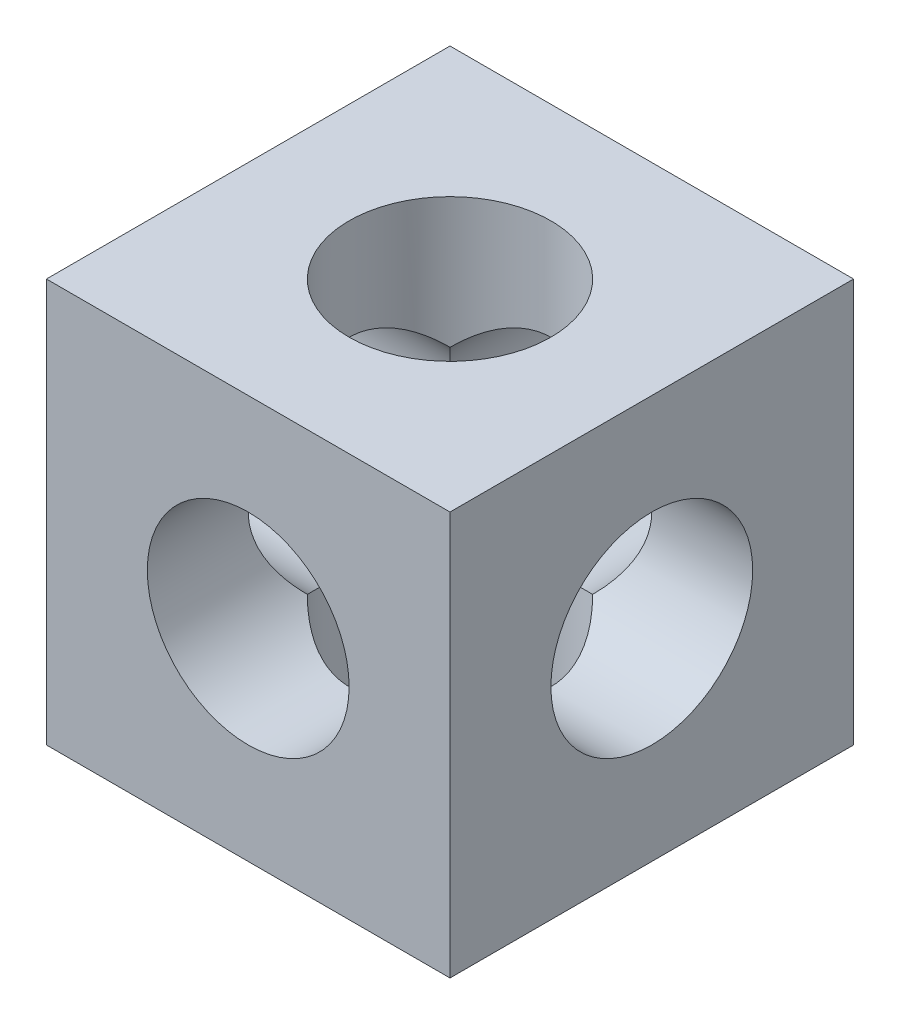
ISO-10303-21;
HEADER;
FILE_DESCRIPTION(('STEP AP214'),'2;1');
FILE_NAME('part.step','',(''),(''),'','','');
FILE_SCHEMA(('AUTOMOTIVE_DESIGN { 1 0 10303 214 1 1 1 1 }'));
ENDSEC;
DATA;
#1=APPLICATION_CONTEXT('core data for automotive mechanical design processes');
#2=APPLICATION_PROTOCOL_DEFINITION('international standard','automotive_design',2000,#1);
#3=PRODUCT_CONTEXT('',#1,'mechanical');
#4=PRODUCT('Part','Part','',(#3));
#5=PRODUCT_RELATED_PRODUCT_CATEGORY('part','',(#4));
#6=PRODUCT_DEFINITION_FORMATION('','',#4);
#7=PRODUCT_DEFINITION_CONTEXT('part definition',#1,'design');
#8=PRODUCT_DEFINITION('design','',#6,#7);
#9=PRODUCT_DEFINITION_SHAPE('','',#8);
#10=(LENGTH_UNIT() NAMED_UNIT(*) SI_UNIT(.MILLI.,.METRE.));
#11=(NAMED_UNIT(*) PLANE_ANGLE_UNIT() SI_UNIT($,.RADIAN.));
#12=(NAMED_UNIT(*) SI_UNIT($,.STERADIAN.) SOLID_ANGLE_UNIT());
#13=UNCERTAINTY_MEASURE_WITH_UNIT(LENGTH_MEASURE(1.E-05),#10,'distance_accuracy_value','');
#14=(GEOMETRIC_REPRESENTATION_CONTEXT(3) GLOBAL_UNCERTAINTY_ASSIGNED_CONTEXT((#13)) GLOBAL_UNIT_ASSIGNED_CONTEXT((#10,
#11,#12)) REPRESENTATION_CONTEXT('',''));
#15=CARTESIAN_POINT('',(0.,0.,0.));
#16=DIRECTION('',(0.,0.,1.));
#17=DIRECTION('',(1.,0.,0.));
#18=AXIS2_PLACEMENT_3D('',#15,#16,#17);
#19=CARTESIAN_POINT('',(3.,6.,-3.));
#20=DIRECTION('',(0.,-1.,0.));
#21=DIRECTION('',(0.,0.,-1.));
#22=AXIS2_PLACEMENT_3D('',#19,#20,#21);
#23=CYLINDRICAL_SURFACE('',#22,1.5);
#24=CARTESIAN_POINT('',(3.,3.,-3.));
#25=DIRECTION('',(0.707106781186547,-0.707106781186547,0.));
#26=DIRECTION('',(-0.707106781186547,-0.707106781186547,0.));
#27=AXIS2_PLACEMENT_3D('',#24,#25,#26);
#28=ELLIPSE('',#27,2.12132034355964,1.5);
#29=CARTESIAN_POINT('',(4.06066017177982,4.06066017177982,-1.93933982822018));
#30=VERTEX_POINT('',#29);
#31=CARTESIAN_POINT('',(4.06066017177982,4.06066017177982,-4.06066017177982));
#32=VERTEX_POINT('',#31);
#33=EDGE_CURVE('E109',#30,#32,#28,.F.);
#34=ORIENTED_EDGE('',*,*,#33,.F.);
#35=CARTESIAN_POINT('',(3.,3.,-3.));
#36=DIRECTION('',(0.,-0.707106781186547,0.707106781186547));
#37=DIRECTION('',(0.,-0.707106781186547,-0.707106781186547));
#38=AXIS2_PLACEMENT_3D('',#35,#36,#37);
#39=ELLIPSE('',#38,2.12132034355964,1.5);
#40=CARTESIAN_POINT('',(1.93933982822018,4.06066017177982,-1.93933982822018));
#41=VERTEX_POINT('',#40);
#42=EDGE_CURVE('E116',#41,#30,#39,.F.);
#43=ORIENTED_EDGE('',*,*,#42,.F.);
#44=CARTESIAN_POINT('',(3.,3.,-3.));
#45=DIRECTION('',(-0.707106781186547,-0.707106781186547,0.));
#46=DIRECTION('',(0.707106781186547,-0.707106781186547,0.));
#47=AXIS2_PLACEMENT_3D('',#44,#45,#46);
#48=ELLIPSE('',#47,2.12132034355964,1.5);
#49=CARTESIAN_POINT('',(1.93933982822018,4.06066017177982,-4.06066017177982));
#50=VERTEX_POINT('',#49);
#51=EDGE_CURVE('E69',#50,#41,#48,.F.);
#52=ORIENTED_EDGE('',*,*,#51,.F.);
#53=CARTESIAN_POINT('',(3.,3.,-3.));
#54=DIRECTION('',(0.,-0.707106781186547,-0.707106781186547));
#55=DIRECTION('',(0.,-0.707106781186547,0.707106781186547));
#56=AXIS2_PLACEMENT_3D('',#53,#54,#55);
#57=ELLIPSE('',#56,2.12132034355964,1.5);
#58=EDGE_CURVE('E122',#32,#50,#57,.F.);
#59=ORIENTED_EDGE('',*,*,#58,.F.);
#60=EDGE_LOOP('',(#34,#43,#52,#59));
#61=FACE_BOUND('',#60,.T.);
#62=CARTESIAN_POINT('',(3.,6.,-3.));
#63=DIRECTION('',(0.,1.,0.));
#64=DIRECTION('',(0.,0.,1.));
#65=AXIS2_PLACEMENT_3D('',#62,#63,#64);
#66=CIRCLE('',#65,1.5);
#67=CARTESIAN_POINT('',(3.,6.,-1.5));
#68=VERTEX_POINT('',#67);
#69=EDGE_CURVE('E171',#68,#68,#66,.T.);
#70=ORIENTED_EDGE('',*,*,#69,.T.);
#71=EDGE_LOOP('',(#70));
#72=FACE_BOUND('',#71,.T.);
#73=ADVANCED_FACE('F45',(#61,#72),#23,.F.);
#74=CARTESIAN_POINT('',(0.,6.,0.));
#75=DIRECTION('',(0.,-1.,0.));
#76=DIRECTION('',(0.,0.,-1.));
#77=AXIS2_PLACEMENT_3D('',#74,#75,#76);
#78=PLANE('',#77);
#79=DIRECTION('',(0.,0.,1.));
#80=VECTOR('',#79,1.);
#81=CARTESIAN_POINT('',(0.,6.,0.));
#82=LINE('',#81,#80);
#83=CARTESIAN_POINT('',(0.,6.,-6.));
#84=VERTEX_POINT('',#83);
#85=CARTESIAN_POINT('',(0.,6.,0.));
#86=VERTEX_POINT('',#85);
#87=EDGE_CURVE('E160',#84,#86,#82,.T.);
#88=ORIENTED_EDGE('',*,*,#87,.T.);
#89=DIRECTION('',(1.,0.,0.));
#90=VECTOR('',#89,1.);
#91=CARTESIAN_POINT('',(0.,6.,0.));
#92=LINE('',#91,#90);
#93=CARTESIAN_POINT('',(6.,6.,0.));
#94=VERTEX_POINT('',#93);
#95=EDGE_CURVE('E177',#86,#94,#92,.T.);
#96=ORIENTED_EDGE('',*,*,#95,.T.);
#97=DIRECTION('',(0.,0.,-1.));
#98=VECTOR('',#97,1.);
#99=CARTESIAN_POINT('',(6.,6.,0.));
#100=LINE('',#99,#98);
#101=CARTESIAN_POINT('',(6.,6.,-6.));
#102=VERTEX_POINT('',#101);
#103=EDGE_CURVE('E174',#94,#102,#100,.T.);
#104=ORIENTED_EDGE('',*,*,#103,.T.);
#105=DIRECTION('',(-1.,0.,0.));
#106=VECTOR('',#105,1.);
#107=CARTESIAN_POINT('',(0.,6.,-6.));
#108=LINE('',#107,#106);
#109=EDGE_CURVE('E156',#102,#84,#108,.T.);
#110=ORIENTED_EDGE('',*,*,#109,.T.);
#111=EDGE_LOOP('',(#88,#96,#104,#110));
#112=FACE_BOUND('',#111,.T.);
#113=ORIENTED_EDGE('',*,*,#69,.F.);
#114=EDGE_LOOP('',(#113));
#115=FACE_BOUND('',#114,.T.);
#116=ADVANCED_FACE('F231',(#112,#115),#78,.F.);
#117=CARTESIAN_POINT('',(0.,0.,0.));
#118=DIRECTION('',(0.,-1.,0.));
#119=DIRECTION('',(0.,0.,-1.));
#120=AXIS2_PLACEMENT_3D('',#117,#118,#119);
#121=PLANE('',#120);
#122=DIRECTION('',(0.,0.,1.));
#123=VECTOR('',#122,1.);
#124=CARTESIAN_POINT('',(0.,0.,0.));
#125=LINE('',#124,#123);
#126=CARTESIAN_POINT('',(0.,0.,-6.));
#127=VERTEX_POINT('',#126);
#128=CARTESIAN_POINT('',(0.,0.,0.));
#129=VERTEX_POINT('',#128);
#130=EDGE_CURVE('E167',#127,#129,#125,.T.);
#131=ORIENTED_EDGE('',*,*,#130,.F.);
#132=DIRECTION('',(-1.,0.,0.));
#133=VECTOR('',#132,1.);
#134=CARTESIAN_POINT('',(0.,0.,-6.));
#135=LINE('',#134,#133);
#136=CARTESIAN_POINT('',(6.,0.,-6.));
#137=VERTEX_POINT('',#136);
#138=EDGE_CURVE('E157',#137,#127,#135,.T.);
#139=ORIENTED_EDGE('',*,*,#138,.F.);
#140=DIRECTION('',(0.,0.,-1.));
#141=VECTOR('',#140,1.);
#142=CARTESIAN_POINT('',(6.,0.,0.));
#143=LINE('',#142,#141);
#144=CARTESIAN_POINT('',(6.,0.,0.));
#145=VERTEX_POINT('',#144);
#146=EDGE_CURVE('E161',#145,#137,#143,.T.);
#147=ORIENTED_EDGE('',*,*,#146,.F.);
#148=DIRECTION('',(1.,0.,0.));
#149=VECTOR('',#148,1.);
#150=CARTESIAN_POINT('',(0.,0.,0.));
#151=LINE('',#150,#149);
#152=EDGE_CURVE('E164',#129,#145,#151,.T.);
#153=ORIENTED_EDGE('',*,*,#152,.F.);
#154=EDGE_LOOP('',(#131,#139,#147,#153));
#155=FACE_BOUND('',#154,.T.);
#156=CARTESIAN_POINT('',(3.,0.,-3.));
#157=DIRECTION('',(0.,1.,0.));
#158=DIRECTION('',(0.,0.,1.));
#159=AXIS2_PLACEMENT_3D('',#156,#157,#158);
#160=CIRCLE('',#159,1.5);
#161=CARTESIAN_POINT('',(3.,0.,-1.5));
#162=VERTEX_POINT('',#161);
#163=EDGE_CURVE('E183',#162,#162,#160,.T.);
#164=ORIENTED_EDGE('',*,*,#163,.T.);
#165=EDGE_LOOP('',(#164));
#166=FACE_BOUND('',#165,.T.);
#167=ADVANCED_FACE('F239',(#155,#166),#121,.T.);
#168=CARTESIAN_POINT('',(0.,6.,0.));
#169=DIRECTION('',(1.,0.,0.));
#170=DIRECTION('',(0.,0.,-1.));
#171=AXIS2_PLACEMENT_3D('',#168,#169,#170);
#172=PLANE('',#171);
#173=CARTESIAN_POINT('',(0.,3.,-3.));
#174=DIRECTION('',(1.,0.,0.));
#175=DIRECTION('',(0.,0.,-1.));
#176=AXIS2_PLACEMENT_3D('',#173,#174,#175);
#177=CIRCLE('',#176,1.5);
#178=CARTESIAN_POINT('',(0.,3.,-4.5));
#179=VERTEX_POINT('',#178);
#180=EDGE_CURVE('E211',#179,#179,#177,.T.);
#181=ORIENTED_EDGE('',*,*,#180,.T.);
#182=EDGE_LOOP('',(#181));
#183=FACE_BOUND('',#182,.T.);
#184=ORIENTED_EDGE('',*,*,#130,.T.);
#185=DIRECTION('',(0.,-1.,0.));
#186=VECTOR('',#185,1.);
#187=CARTESIAN_POINT('',(0.,6.,0.));
#188=LINE('',#187,#186);
#189=EDGE_CURVE('E140',#86,#129,#188,.T.);
#190=ORIENTED_EDGE('',*,*,#189,.F.);
#191=ORIENTED_EDGE('',*,*,#87,.F.);
#192=DIRECTION('',(0.,-1.,0.));
#193=VECTOR('',#192,1.);
#194=CARTESIAN_POINT('',(0.,6.,-6.));
#195=LINE('',#194,#193);
#196=EDGE_CURVE('E152',#84,#127,#195,.T.);
#197=ORIENTED_EDGE('',*,*,#196,.T.);
#198=EDGE_LOOP('',(#184,#190,#191,#197));
#199=FACE_BOUND('',#198,.T.);
#200=ADVANCED_FACE('F47',(#183,#199),#172,.F.);
#201=CARTESIAN_POINT('',(0.,6.,0.));
#202=DIRECTION('',(0.,0.,-1.));
#203=DIRECTION('',(-1.,0.,0.));
#204=AXIS2_PLACEMENT_3D('',#201,#202,#203);
#205=PLANE('',#204);
#206=CARTESIAN_POINT('',(3.,3.,0.));
#207=DIRECTION('',(0.,0.,1.));
#208=DIRECTION('',(1.,0.,0.));
#209=AXIS2_PLACEMENT_3D('',#206,#207,#208);
#210=CIRCLE('',#209,1.5);
#211=CARTESIAN_POINT('',(4.5,3.,0.));
#212=VERTEX_POINT('',#211);
#213=EDGE_CURVE('E191',#212,#212,#210,.T.);
#214=ORIENTED_EDGE('',*,*,#213,.F.);
#215=EDGE_LOOP('',(#214));
#216=FACE_BOUND('',#215,.T.);
#217=ORIENTED_EDGE('',*,*,#152,.T.);
#218=DIRECTION('',(0.,-1.,0.));
#219=VECTOR('',#218,1.);
#220=CARTESIAN_POINT('',(6.,6.,0.));
#221=LINE('',#220,#219);
#222=EDGE_CURVE('E144',#94,#145,#221,.T.);
#223=ORIENTED_EDGE('',*,*,#222,.F.);
#224=ORIENTED_EDGE('',*,*,#95,.F.);
#225=ORIENTED_EDGE('',*,*,#189,.T.);
#226=EDGE_LOOP('',(#217,#223,#224,#225));
#227=FACE_BOUND('',#226,.T.);
#228=ADVANCED_FACE('F265',(#216,#227),#205,.F.);
#229=CARTESIAN_POINT('',(6.,6.,0.));
#230=DIRECTION('',(-1.,0.,0.));
#231=DIRECTION('',(0.,0.,1.));
#232=AXIS2_PLACEMENT_3D('',#229,#230,#231);
#233=PLANE('',#232);
#234=CARTESIAN_POINT('',(6.,3.,-3.));
#235=DIRECTION('',(1.,0.,0.));
#236=DIRECTION('',(0.,0.,-1.));
#237=AXIS2_PLACEMENT_3D('',#234,#235,#236);
#238=CIRCLE('',#237,1.5);
#239=CARTESIAN_POINT('',(6.,3.,-4.5));
#240=VERTEX_POINT('',#239);
#241=EDGE_CURVE('E212',#240,#240,#238,.T.);
#242=ORIENTED_EDGE('',*,*,#241,.F.);
#243=EDGE_LOOP('',(#242));
#244=FACE_BOUND('',#243,.T.);
#245=ORIENTED_EDGE('',*,*,#146,.T.);
#246=DIRECTION('',(0.,-1.,0.));
#247=VECTOR('',#246,1.);
#248=CARTESIAN_POINT('',(6.,6.,-6.));
#249=LINE('',#248,#247);
#250=EDGE_CURVE('E148',#102,#137,#249,.T.);
#251=ORIENTED_EDGE('',*,*,#250,.F.);
#252=ORIENTED_EDGE('',*,*,#103,.F.);
#253=ORIENTED_EDGE('',*,*,#222,.T.);
#254=EDGE_LOOP('',(#245,#251,#252,#253));
#255=FACE_BOUND('',#254,.T.);
#256=ADVANCED_FACE('F251',(#244,#255),#233,.F.);
#257=CARTESIAN_POINT('',(0.,6.,-6.));
#258=DIRECTION('',(0.,0.,1.));
#259=DIRECTION('',(1.,0.,0.));
#260=AXIS2_PLACEMENT_3D('',#257,#258,#259);
#261=PLANE('',#260);
#262=CARTESIAN_POINT('',(3.,3.,-6.));
#263=DIRECTION('',(0.,0.,1.));
#264=DIRECTION('',(1.,0.,0.));
#265=AXIS2_PLACEMENT_3D('',#262,#263,#264);
#266=CIRCLE('',#265,1.5);
#267=CARTESIAN_POINT('',(4.5,3.,-6.));
#268=VERTEX_POINT('',#267);
#269=EDGE_CURVE('E187',#268,#268,#266,.T.);
#270=ORIENTED_EDGE('',*,*,#269,.T.);
#271=EDGE_LOOP('',(#270));
#272=FACE_BOUND('',#271,.T.);
#273=ORIENTED_EDGE('',*,*,#138,.T.);
#274=ORIENTED_EDGE('',*,*,#196,.F.);
#275=ORIENTED_EDGE('',*,*,#109,.F.);
#276=ORIENTED_EDGE('',*,*,#250,.T.);
#277=EDGE_LOOP('',(#273,#274,#275,#276));
#278=FACE_BOUND('',#277,.T.);
#279=ADVANCED_FACE('F244',(#272,#278),#261,.F.);
#280=CARTESIAN_POINT('',(3.,3.,-3.));
#281=DIRECTION('',(0.707106781186547,-0.707106781186547,0.));
#282=DIRECTION('',(-0.707106781186547,-0.707106781186547,0.));
#283=AXIS2_PLACEMENT_3D('',#280,#281,#282);
#284=ELLIPSE('',#283,2.12132034355964,1.5);
#285=CARTESIAN_POINT('',(1.93933982822018,1.93933982822018,-1.93933982822018));
#286=VERTEX_POINT('',#285);
#287=CARTESIAN_POINT('',(1.93933982822018,1.93933982822018,-4.06066017177982));
#288=VERTEX_POINT('',#287);
#289=EDGE_CURVE('E204',#286,#288,#284,.T.);
#290=ORIENTED_EDGE('',*,*,#289,.F.);
#291=CARTESIAN_POINT('',(3.,3.,-3.));
#292=DIRECTION('',(0.,-0.707106781186547,-0.707106781186547));
#293=DIRECTION('',(0.,-0.707106781186547,0.707106781186547));
#294=AXIS2_PLACEMENT_3D('',#291,#292,#293);
#295=ELLIPSE('',#294,2.12132034355964,1.5);
#296=CARTESIAN_POINT('',(4.06066017177982,1.93933982822018,-1.93933982822018));
#297=VERTEX_POINT('',#296);
#298=EDGE_CURVE('E133',#297,#286,#295,.T.);
#299=ORIENTED_EDGE('',*,*,#298,.F.);
#300=CARTESIAN_POINT('',(3.,3.,-3.));
#301=DIRECTION('',(-0.707106781186547,-0.707106781186547,0.));
#302=DIRECTION('',(0.707106781186547,-0.707106781186547,0.));
#303=AXIS2_PLACEMENT_3D('',#300,#301,#302);
#304=ELLIPSE('',#303,2.12132034355964,1.5);
#305=CARTESIAN_POINT('',(4.06066017177982,1.93933982822018,-4.06066017177982));
#306=VERTEX_POINT('',#305);
#307=EDGE_CURVE('E61',#306,#297,#304,.T.);
#308=ORIENTED_EDGE('',*,*,#307,.F.);
#309=CARTESIAN_POINT('',(3.,3.,-3.));
#310=DIRECTION('',(0.,-0.707106781186547,0.707106781186547));
#311=DIRECTION('',(0.,-0.707106781186547,-0.707106781186547));
#312=AXIS2_PLACEMENT_3D('',#309,#310,#311);
#313=ELLIPSE('',#312,2.12132034355964,1.5);
#314=EDGE_CURVE('E129',#288,#306,#313,.T.);
#315=ORIENTED_EDGE('',*,*,#314,.F.);
#316=EDGE_LOOP('',(#290,#299,#308,#315));
#317=FACE_BOUND('',#316,.T.);
#318=ORIENTED_EDGE('',*,*,#163,.F.);
#319=EDGE_LOOP('',(#318));
#320=FACE_BOUND('',#319,.T.);
#321=ADVANCED_FACE('F233',(#317,#320),#23,.F.);
#322=CARTESIAN_POINT('',(3.,3.,-6.));
#323=DIRECTION('',(0.,0.,1.));
#324=DIRECTION('',(1.,0.,0.));
#325=AXIS2_PLACEMENT_3D('',#322,#323,#324);
#326=CYLINDRICAL_SURFACE('',#325,1.5);
#327=ORIENTED_EDGE('',*,*,#314,.T.);
#328=CARTESIAN_POINT('',(3.,3.,-3.));
#329=DIRECTION('',(0.707106781186547,0.,0.707106781186547));
#330=DIRECTION('',(-0.707106781186547,0.,0.707106781186547));
#331=AXIS2_PLACEMENT_3D('',#328,#329,#330);
#332=ELLIPSE('',#331,2.12132034355964,1.5);
#333=EDGE_CURVE('E124',#306,#32,#332,.T.);
#334=ORIENTED_EDGE('',*,*,#333,.T.);
#335=ORIENTED_EDGE('',*,*,#58,.T.);
#336=CARTESIAN_POINT('',(3.,3.,-3.));
#337=DIRECTION('',(-0.707106781186547,0.,0.707106781186547));
#338=DIRECTION('',(0.707106781186547,0.,0.707106781186547));
#339=AXIS2_PLACEMENT_3D('',#336,#337,#338);
#340=ELLIPSE('',#339,2.12132034355964,1.5);
#341=EDGE_CURVE('E195',#50,#288,#340,.T.);
#342=ORIENTED_EDGE('',*,*,#341,.T.);
#343=EDGE_LOOP('',(#327,#334,#335,#342));
#344=FACE_BOUND('',#343,.T.);
#345=ORIENTED_EDGE('',*,*,#269,.F.);
#346=EDGE_LOOP('',(#345));
#347=FACE_BOUND('',#346,.T.);
#348=ADVANCED_FACE('F243',(#344,#347),#326,.F.);
#349=ORIENTED_EDGE('',*,*,#298,.T.);
#350=CARTESIAN_POINT('',(3.,3.,-3.));
#351=DIRECTION('',(0.707106781186547,0.,0.707106781186547));
#352=DIRECTION('',(-0.707106781186547,0.,0.707106781186547));
#353=AXIS2_PLACEMENT_3D('',#350,#351,#352);
#354=ELLIPSE('',#353,2.12132034355964,1.5);
#355=EDGE_CURVE('E11',#286,#41,#354,.F.);
#356=ORIENTED_EDGE('',*,*,#355,.T.);
#357=ORIENTED_EDGE('',*,*,#42,.T.);
#358=CARTESIAN_POINT('',(3.,3.,-3.));
#359=DIRECTION('',(-0.707106781186547,0.,0.707106781186547));
#360=DIRECTION('',(0.707106781186547,0.,0.707106781186547));
#361=AXIS2_PLACEMENT_3D('',#358,#359,#360);
#362=ELLIPSE('',#361,2.12132034355964,1.5);
#363=EDGE_CURVE('E54',#30,#297,#362,.F.);
#364=ORIENTED_EDGE('',*,*,#363,.T.);
#365=EDGE_LOOP('',(#349,#356,#357,#364));
#366=FACE_BOUND('',#365,.T.);
#367=ORIENTED_EDGE('',*,*,#213,.T.);
#368=EDGE_LOOP('',(#367));
#369=FACE_BOUND('',#368,.T.);
#370=ADVANCED_FACE('F126',(#366,#369),#326,.F.);
#371=CARTESIAN_POINT('',(0.,3.,-3.));
#372=DIRECTION('',(1.,0.,0.));
#373=DIRECTION('',(0.,0.,-1.));
#374=AXIS2_PLACEMENT_3D('',#371,#372,#373);
#375=CYLINDRICAL_SURFACE('',#374,1.5);
#376=ORIENTED_EDGE('',*,*,#241,.T.);
#377=EDGE_LOOP('',(#376));
#378=FACE_BOUND('',#377,.T.);
#379=ORIENTED_EDGE('',*,*,#307,.T.);
#380=ORIENTED_EDGE('',*,*,#363,.F.);
#381=ORIENTED_EDGE('',*,*,#33,.T.);
#382=ORIENTED_EDGE('',*,*,#333,.F.);
#383=EDGE_LOOP('',(#379,#380,#381,#382));
#384=FACE_BOUND('',#383,.T.);
#385=ADVANCED_FACE('F108',(#378,#384),#375,.F.);
#386=ORIENTED_EDGE('',*,*,#180,.F.);
#387=EDGE_LOOP('',(#386));
#388=FACE_BOUND('',#387,.T.);
#389=ORIENTED_EDGE('',*,*,#51,.T.);
#390=ORIENTED_EDGE('',*,*,#355,.F.);
#391=ORIENTED_EDGE('',*,*,#289,.T.);
#392=ORIENTED_EDGE('',*,*,#341,.F.);
#393=EDGE_LOOP('',(#389,#390,#391,#392));
#394=FACE_BOUND('',#393,.T.);
#395=ADVANCED_FACE('F222',(#388,#394),#375,.F.);
#396=CLOSED_SHELL('',(#73,#116,#167,#200,#228,#256,#279,#321,#348,#370,#385,#395));
#397=MANIFOLD_SOLID_BREP('B2',#396);
#398=ADVANCED_BREP_SHAPE_REPRESENTATION('',(#18,#397),#14);
#399=SHAPE_DEFINITION_REPRESENTATION(#9,#398);
ENDSEC;
END-ISO-10303-21;
